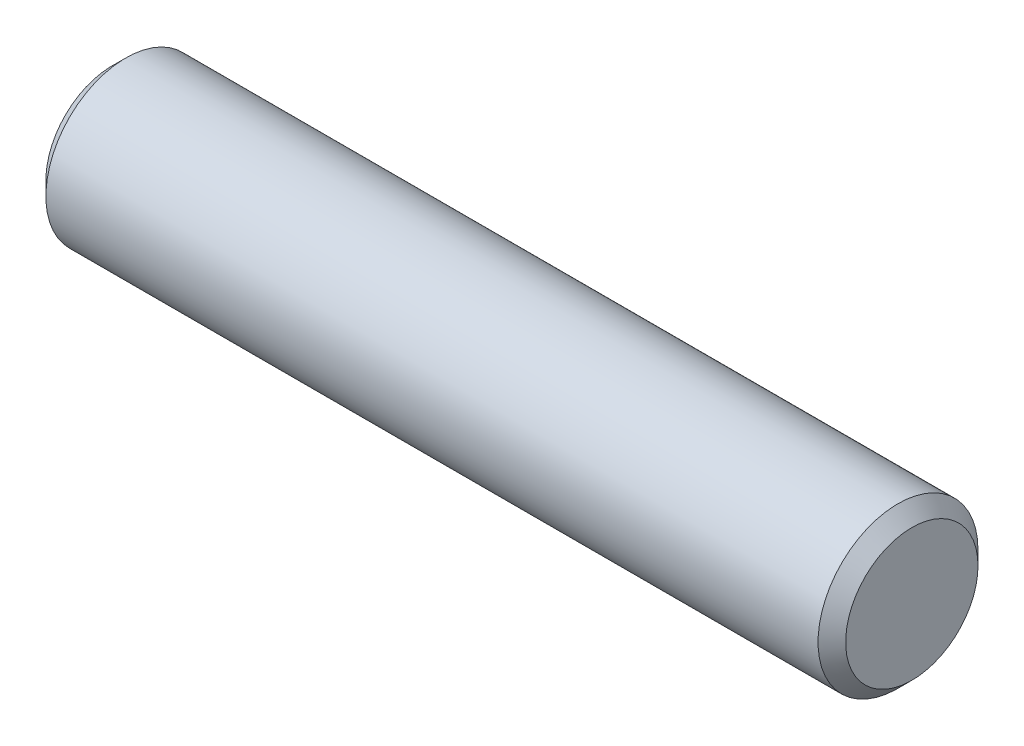
ISO-10303-21;
HEADER;
FILE_DESCRIPTION(('STEP AP214'),'2;1');
FILE_NAME('part.step','',(''),(''),'','','');
FILE_SCHEMA(('AUTOMOTIVE_DESIGN { 1 0 10303 214 1 1 1 1 }'));
ENDSEC;
DATA;
#1=APPLICATION_CONTEXT('core data for automotive mechanical design processes');
#2=APPLICATION_PROTOCOL_DEFINITION('international standard','automotive_design',2000,#1);
#3=PRODUCT_CONTEXT('',#1,'mechanical');
#4=PRODUCT('Part','Part','',(#3));
#5=PRODUCT_RELATED_PRODUCT_CATEGORY('part','',(#4));
#6=PRODUCT_DEFINITION_FORMATION('','',#4);
#7=PRODUCT_DEFINITION_CONTEXT('part definition',#1,'design');
#8=PRODUCT_DEFINITION('design','',#6,#7);
#9=PRODUCT_DEFINITION_SHAPE('','',#8);
#10=(LENGTH_UNIT() NAMED_UNIT(*) SI_UNIT(.MILLI.,.METRE.));
#11=(NAMED_UNIT(*) PLANE_ANGLE_UNIT() SI_UNIT($,.RADIAN.));
#12=(NAMED_UNIT(*) SI_UNIT($,.STERADIAN.) SOLID_ANGLE_UNIT());
#13=UNCERTAINTY_MEASURE_WITH_UNIT(LENGTH_MEASURE(1.E-05),#10,'distance_accuracy_value','');
#14=(GEOMETRIC_REPRESENTATION_CONTEXT(3) GLOBAL_UNCERTAINTY_ASSIGNED_CONTEXT((#13)) GLOBAL_UNIT_ASSIGNED_CONTEXT((#10,
#11,#12)) REPRESENTATION_CONTEXT('',''));
#15=CARTESIAN_POINT('',(0.,0.,0.));
#16=DIRECTION('',(0.,0.,1.));
#17=DIRECTION('',(1.,0.,0.));
#18=AXIS2_PLACEMENT_3D('',#15,#16,#17);
#19=CARTESIAN_POINT('',(0.,4.,0.));
#20=DIRECTION('',(1.,0.,0.));
#21=DIRECTION('',(0.,0.,-1.));
#22=AXIS2_PLACEMENT_3D('',#19,#20,#21);
#23=PLANE('',#22);
#24=CARTESIAN_POINT('',(0.,0.,0.));
#25=DIRECTION('',(1.,0.,0.));
#26=DIRECTION('',(0.,0.,-1.));
#27=AXIS2_PLACEMENT_3D('',#24,#25,#26);
#28=CIRCLE('',#27,3.3095);
#29=CARTESIAN_POINT('',(0.,0.,-3.3095));
#30=VERTEX_POINT('',#29);
#31=EDGE_CURVE('E45',#30,#30,#28,.F.);
#32=ORIENTED_EDGE('',*,*,#31,.T.);
#33=EDGE_LOOP('',(#32));
#34=FACE_BOUND('',#33,.T.);
#35=ADVANCED_FACE('F30',(#34),#23,.F.);
#36=CARTESIAN_POINT('',(40.,4.,0.));
#37=DIRECTION('',(1.,0.,0.));
#38=DIRECTION('',(0.,0.,-1.));
#39=AXIS2_PLACEMENT_3D('',#36,#37,#38);
#40=PLANE('',#39);
#41=CARTESIAN_POINT('',(40.,0.,0.));
#42=DIRECTION('',(1.,0.,0.));
#43=DIRECTION('',(0.,0.,-1.));
#44=AXIS2_PLACEMENT_3D('',#41,#42,#43);
#45=CIRCLE('',#44,3.3095);
#46=CARTESIAN_POINT('',(40.,0.,-3.3095));
#47=VERTEX_POINT('',#46);
#48=EDGE_CURVE('E10',#47,#47,#45,.T.);
#49=ORIENTED_EDGE('',*,*,#48,.T.);
#50=EDGE_LOOP('',(#49));
#51=FACE_BOUND('',#50,.T.);
#52=ADVANCED_FACE('F61',(#51),#40,.T.);
#53=CARTESIAN_POINT('',(-3.175,0.,0.));
#54=DIRECTION('',(-1.,0.,0.));
#55=DIRECTION('',(0.,0.,1.));
#56=AXIS2_PLACEMENT_3D('',#53,#54,#55);
#57=CYLINDRICAL_SURFACE('',#56,4.);
#58=CARTESIAN_POINT('',(0.690500000000003,0.,0.));
#59=DIRECTION('',(1.,0.,0.));
#60=DIRECTION('',(0.,0.,-1.));
#61=AXIS2_PLACEMENT_3D('',#58,#59,#60);
#62=CIRCLE('',#61,4.);
#63=CARTESIAN_POINT('',(0.690500000000003,0.,-4.));
#64=VERTEX_POINT('',#63);
#65=EDGE_CURVE('E37',#64,#64,#62,.T.);
#66=ORIENTED_EDGE('',*,*,#65,.T.);
#67=EDGE_LOOP('',(#66));
#68=FACE_BOUND('',#67,.T.);
#69=CARTESIAN_POINT('',(39.3095,0.,0.));
#70=DIRECTION('',(1.,0.,0.));
#71=DIRECTION('',(0.,0.,-1.));
#72=AXIS2_PLACEMENT_3D('',#69,#70,#71);
#73=CIRCLE('',#72,4.);
#74=CARTESIAN_POINT('',(39.3095,0.,-4.));
#75=VERTEX_POINT('',#74);
#76=EDGE_CURVE('E41',#75,#75,#73,.F.);
#77=ORIENTED_EDGE('',*,*,#76,.T.);
#78=EDGE_LOOP('',(#77));
#79=FACE_BOUND('',#78,.T.);
#80=ADVANCED_FACE('F54',(#68,#79),#57,.T.);
#81=CARTESIAN_POINT('',(0.,0.,0.));
#82=DIRECTION('',(1.,0.,0.));
#83=DIRECTION('',(0.,0.,-1.));
#84=AXIS2_PLACEMENT_3D('',#81,#82,#83);
#85=CONICAL_SURFACE('',#84,3.3095,0.785398163397446);
#86=ORIENTED_EDGE('',*,*,#65,.F.);
#87=EDGE_LOOP('',(#86));
#88=FACE_BOUND('',#87,.T.);
#89=ORIENTED_EDGE('',*,*,#31,.F.);
#90=EDGE_LOOP('',(#89));
#91=FACE_BOUND('',#90,.T.);
#92=ADVANCED_FACE('F52',(#88,#91),#85,.T.);
#93=CARTESIAN_POINT('',(39.3095,0.,0.));
#94=DIRECTION('',(-1.,0.,0.));
#95=DIRECTION('',(0.,0.,1.));
#96=AXIS2_PLACEMENT_3D('',#93,#94,#95);
#97=CONICAL_SURFACE('',#96,4.,0.785398163397447);
#98=ORIENTED_EDGE('',*,*,#48,.F.);
#99=EDGE_LOOP('',(#98));
#100=FACE_BOUND('',#99,.T.);
#101=ORIENTED_EDGE('',*,*,#76,.F.);
#102=EDGE_LOOP('',(#101));
#103=FACE_BOUND('',#102,.T.);
#104=ADVANCED_FACE('F32',(#100,#103),#97,.T.);
#105=CLOSED_SHELL('',(#35,#52,#80,#92,#104));
#106=MANIFOLD_SOLID_BREP('B2',#105);
#107=ADVANCED_BREP_SHAPE_REPRESENTATION('',(#18,#106),#14);
#108=SHAPE_DEFINITION_REPRESENTATION(#9,#107);
ENDSEC;
END-ISO-10303-21;
